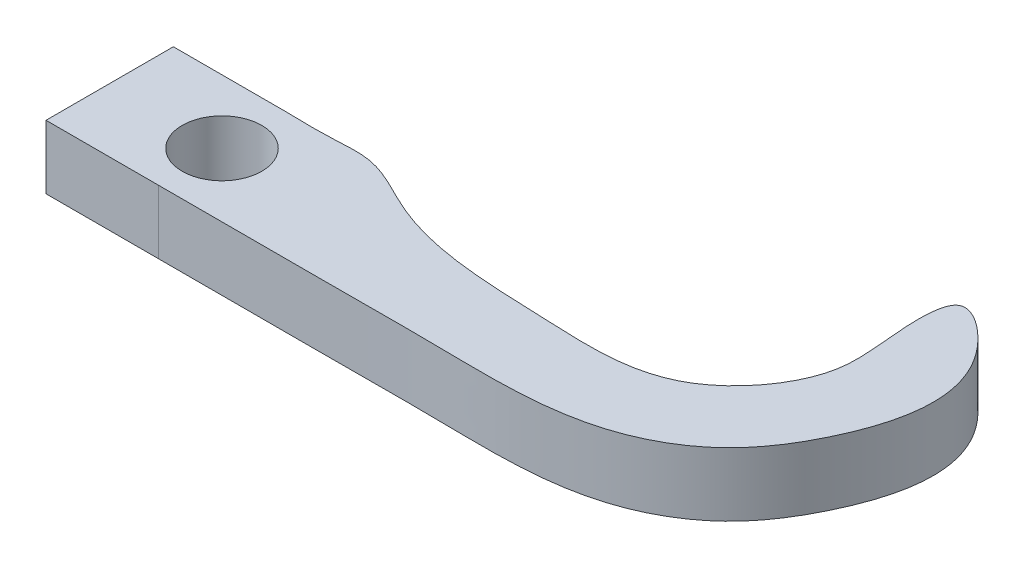
ISO-10303-21;
HEADER;
FILE_DESCRIPTION(('STEP AP214'),'2;1');
FILE_NAME('part.step','',(''),(''),'','','');
FILE_SCHEMA(('AUTOMOTIVE_DESIGN { 1 0 10303 214 1 1 1 1 }'));
ENDSEC;
DATA;
#1=APPLICATION_CONTEXT('core data for automotive mechanical design processes');
#2=APPLICATION_PROTOCOL_DEFINITION('international standard','automotive_design',2000,#1);
#3=PRODUCT_CONTEXT('',#1,'mechanical');
#4=PRODUCT('Part','Part','',(#3));
#5=PRODUCT_RELATED_PRODUCT_CATEGORY('part','',(#4));
#6=PRODUCT_DEFINITION_FORMATION('','',#4);
#7=PRODUCT_DEFINITION_CONTEXT('part definition',#1,'design');
#8=PRODUCT_DEFINITION('design','',#6,#7);
#9=PRODUCT_DEFINITION_SHAPE('','',#8);
#10=(LENGTH_UNIT() NAMED_UNIT(*) SI_UNIT(.MILLI.,.METRE.));
#11=(NAMED_UNIT(*) PLANE_ANGLE_UNIT() SI_UNIT($,.RADIAN.));
#12=(NAMED_UNIT(*) SI_UNIT($,.STERADIAN.) SOLID_ANGLE_UNIT());
#13=UNCERTAINTY_MEASURE_WITH_UNIT(LENGTH_MEASURE(1.E-05),#10,'distance_accuracy_value','');
#14=(GEOMETRIC_REPRESENTATION_CONTEXT(3) GLOBAL_UNCERTAINTY_ASSIGNED_CONTEXT((#13)) GLOBAL_UNIT_ASSIGNED_CONTEXT((#10,
#11,#12)) REPRESENTATION_CONTEXT('',''));
#15=CARTESIAN_POINT('',(0.,0.,0.));
#16=DIRECTION('',(0.,0.,1.));
#17=DIRECTION('',(1.,0.,0.));
#18=AXIS2_PLACEMENT_3D('',#15,#16,#17);
#19=CARTESIAN_POINT('',(35.1912141041976,4.,-12.0045204925512));
#20=DIRECTION('',(0.,-1.,0.));
#21=DIRECTION('',(0.,0.,-1.));
#22=AXIS2_PLACEMENT_3D('',#19,#20,#21);
#23=PLANE('',#22);
#24=DIRECTION('',(-1.,0.,0.));
#25=VECTOR('',#24,1.);
#26=CARTESIAN_POINT('',(0.,4.,-4.));
#27=LINE('',#26,#25);
#28=CARTESIAN_POINT('',(0.,4.,-4.));
#29=VERTEX_POINT('',#28);
#30=CARTESIAN_POINT('',(-7.05322672147617,4.,-4.));
#31=VERTEX_POINT('',#30);
#32=EDGE_CURVE('E105',#29,#31,#27,.T.);
#33=ORIENTED_EDGE('',*,*,#32,.T.);
#34=DIRECTION('',(0.,0.,1.));
#35=VECTOR('',#34,1.);
#36=CARTESIAN_POINT('',(-7.05322672147617,4.,-4.));
#37=LINE('',#36,#35);
#38=CARTESIAN_POINT('',(-7.05322672147617,4.,4.));
#39=VERTEX_POINT('',#38);
#40=EDGE_CURVE('E98',#31,#39,#37,.T.);
#41=ORIENTED_EDGE('',*,*,#40,.T.);
#42=DIRECTION('',(1.,0.,0.));
#43=VECTOR('',#42,1.);
#44=CARTESIAN_POINT('',(-7.05322672147617,4.,4.));
#45=LINE('',#44,#43);
#46=CARTESIAN_POINT('',(0.,4.,4.));
#47=VERTEX_POINT('',#46);
#48=EDGE_CURVE('E104',#39,#47,#45,.T.);
#49=ORIENTED_EDGE('',*,*,#48,.T.);
#50=CARTESIAN_POINT('',(0.,4.,-4.));
#51=CARTESIAN_POINT('',(0.965154345947019,4.,-3.97792964392842));
#52=CARTESIAN_POINT('',(2.67626900055874,4.,-3.93880128081721));
#53=CARTESIAN_POINT('',(5.74833844442336,4.,-4.23512677444015));
#54=CARTESIAN_POINT('',(10.7984314772553,4.,-1.04303073581933));
#55=CARTESIAN_POINT('',(18.4189312249459,4.,-0.983332766275496));
#56=CARTESIAN_POINT('',(27.4063160734475,4.,-0.415105224257914));
#57=CARTESIAN_POINT('',(31.8485847497434,4.,-6.50956385262234));
#58=CARTESIAN_POINT('',(31.178499136289,4.,-10.5990477140092));
#59=CARTESIAN_POINT('',(31.0094108606181,4.,-15.9202524369857));
#60=CARTESIAN_POINT('',(37.3084497130983,4.,-11.2163061526473));
#61=CARTESIAN_POINT('',(35.8049970075755,4.,-4.56724095293301));
#62=CARTESIAN_POINT('',(32.4111479345509,4.,0.650692495093639));
#63=CARTESIAN_POINT('',(26.4670565607253,4.,4.2639642325186));
#64=CARTESIAN_POINT('',(18.8603426250174,4.,3.94179808510999));
#65=CARTESIAN_POINT('',(11.6430989519811,4.,4.00660071043614));
#66=CARTESIAN_POINT('',(5.80742249566911,4.,3.99764544498582));
#67=CARTESIAN_POINT('',(2.23579185294919,4.,3.99909352300062));
#68=CARTESIAN_POINT('',(0.,4.,4.));
#69=B_SPLINE_CURVE_WITH_KNOTS('',3,(#50,#51,#52,#53,#54,#55,#56,#57,#58,#59,#60,#61,#62,#63,#64,
#65,#66,#67,#68),.UNSPECIFIED.,.F.,.F.,(4,1,1,1,1,1,1,1,1,1,1,1,1,1,1,1,4),(0.,
0.0315230282209945,0.0558869322540911,0.0980024449357112,0.216060448083261,0.302293822302607,
0.37341837284398,0.416617427236156,0.454314907816136,0.48895260099763,0.591586624010205,
0.647126474055905,0.690459149561825,0.810546038048183,0.883818874327126,0.927272206946891,1.),.UNSPECIFIED.);
#70=EDGE_CURVE('E114',#29,#47,#69,.T.);
#71=ORIENTED_EDGE('',*,*,#70,.F.);
#72=EDGE_LOOP('',(#33,#41,#49,#71));
#73=FACE_BOUND('',#72,.T.);
#74=CARTESIAN_POINT('',(0.,4.,0.));
#75=DIRECTION('',(0.,1.,0.));
#76=DIRECTION('',(0.,0.,1.));
#77=AXIS2_PLACEMENT_3D('',#74,#75,#76);
#78=CIRCLE('',#77,2.5);
#79=CARTESIAN_POINT('',(0.,4.,2.5));
#80=VERTEX_POINT('',#79);
#81=EDGE_CURVE('E153',#80,#80,#78,.T.);
#82=ORIENTED_EDGE('',*,*,#81,.F.);
#83=EDGE_LOOP('',(#82));
#84=FACE_BOUND('',#83,.T.);
#85=ADVANCED_FACE('F55',(#73,#84),#23,.F.);
#86=CARTESIAN_POINT('',(35.1912141041976,0.,-12.0045204925512));
#87=DIRECTION('',(0.,-1.,0.));
#88=DIRECTION('',(0.,0.,-1.));
#89=AXIS2_PLACEMENT_3D('',#86,#87,#88);
#90=PLANE('',#89);
#91=DIRECTION('',(-1.,0.,0.));
#92=VECTOR('',#91,1.);
#93=CARTESIAN_POINT('',(0.,0.,-4.));
#94=LINE('',#93,#92);
#95=CARTESIAN_POINT('',(0.,0.,-4.));
#96=VERTEX_POINT('',#95);
#97=CARTESIAN_POINT('',(-7.05322672147617,0.,-4.));
#98=VERTEX_POINT('',#97);
#99=EDGE_CURVE('E122',#96,#98,#94,.T.);
#100=ORIENTED_EDGE('',*,*,#99,.F.);
#101=CARTESIAN_POINT('',(0.,0.,-4.));
#102=CARTESIAN_POINT('',(0.965154345947019,0.,-3.97792964392842));
#103=CARTESIAN_POINT('',(2.67626900055874,0.,-3.93880128081721));
#104=CARTESIAN_POINT('',(5.74833844442336,0.,-4.23512677444015));
#105=CARTESIAN_POINT('',(10.7984314772553,0.,-1.04303073581933));
#106=CARTESIAN_POINT('',(18.4189312249459,0.,-0.983332766275496));
#107=CARTESIAN_POINT('',(27.4063160734475,0.,-0.415105224257914));
#108=CARTESIAN_POINT('',(31.8485847497434,0.,-6.50956385262234));
#109=CARTESIAN_POINT('',(31.178499136289,0.,-10.5990477140092));
#110=CARTESIAN_POINT('',(31.0094108606181,0.,-15.9202524369857));
#111=CARTESIAN_POINT('',(37.3084497130983,0.,-11.2163061526473));
#112=CARTESIAN_POINT('',(35.8049970075755,0.,-4.56724095293301));
#113=CARTESIAN_POINT('',(32.4111479345509,0.,0.650692495093639));
#114=CARTESIAN_POINT('',(26.4670565607253,0.,4.2639642325186));
#115=CARTESIAN_POINT('',(18.8603426250174,0.,3.94179808510999));
#116=CARTESIAN_POINT('',(11.6430989519811,0.,4.00660071043614));
#117=CARTESIAN_POINT('',(5.80742249566911,0.,3.99764544498582));
#118=CARTESIAN_POINT('',(2.23579185294919,0.,3.99909352300062));
#119=CARTESIAN_POINT('',(0.,0.,4.));
#120=B_SPLINE_CURVE_WITH_KNOTS('',3,(#101,#102,#103,#104,#105,#106,#107,#108,#109,#110,#111,
#112,#113,#114,#115,#116,#117,#118,#119),.UNSPECIFIED.,.F.,.F.,(4,1,1,1,1,1,1,1,1,1,1,1,1,1,1,1,
4),(0.,0.0315230282209945,0.0558869322540911,0.0980024449357112,0.216060448083261,
0.302293822302607,0.37341837284398,0.416617427236156,0.454314907816136,0.48895260099763,
0.591586624010205,0.647126474055905,0.690459149561825,0.810546038048183,0.883818874327126,
0.927272206946891,1.),.UNSPECIFIED.);
#121=CARTESIAN_POINT('',(0.,0.,4.));
#122=VERTEX_POINT('',#121);
#123=EDGE_CURVE('E160',#96,#122,#120,.T.);
#124=ORIENTED_EDGE('',*,*,#123,.T.);
#125=DIRECTION('',(1.,0.,0.));
#126=VECTOR('',#125,1.);
#127=CARTESIAN_POINT('',(-7.05322672147617,0.,4.));
#128=LINE('',#127,#126);
#129=CARTESIAN_POINT('',(-7.05322672147617,0.,4.));
#130=VERTEX_POINT('',#129);
#131=EDGE_CURVE('E162',#130,#122,#128,.T.);
#132=ORIENTED_EDGE('',*,*,#131,.F.);
#133=DIRECTION('',(0.,0.,1.));
#134=VECTOR('',#133,1.);
#135=CARTESIAN_POINT('',(-7.05322672147617,0.,-4.));
#136=LINE('',#135,#134);
#137=EDGE_CURVE('E110',#98,#130,#136,.T.);
#138=ORIENTED_EDGE('',*,*,#137,.F.);
#139=EDGE_LOOP('',(#100,#124,#132,#138));
#140=FACE_BOUND('',#139,.T.);
#141=CARTESIAN_POINT('',(0.,0.,0.));
#142=DIRECTION('',(0.,1.,0.));
#143=DIRECTION('',(0.,0.,1.));
#144=AXIS2_PLACEMENT_3D('',#141,#142,#143);
#145=CIRCLE('',#144,2.5);
#146=CARTESIAN_POINT('',(0.,0.,2.5));
#147=VERTEX_POINT('',#146);
#148=EDGE_CURVE('E156',#147,#147,#145,.T.);
#149=ORIENTED_EDGE('',*,*,#148,.T.);
#150=EDGE_LOOP('',(#149));
#151=FACE_BOUND('',#150,.T.);
#152=ADVANCED_FACE('F133',(#140,#151),#90,.T.);
#153=CARTESIAN_POINT('',(0.,4.,-4.));
#154=DIRECTION('',(0.,0.,1.));
#155=DIRECTION('',(1.,0.,0.));
#156=AXIS2_PLACEMENT_3D('',#153,#154,#155);
#157=PLANE('',#156);
#158=ORIENTED_EDGE('',*,*,#99,.T.);
#159=DIRECTION('',(0.,-1.,0.));
#160=VECTOR('',#159,1.);
#161=CARTESIAN_POINT('',(-7.05322672147617,4.,-4.));
#162=LINE('',#161,#160);
#163=EDGE_CURVE('E12',#31,#98,#162,.T.);
#164=ORIENTED_EDGE('',*,*,#163,.F.);
#165=ORIENTED_EDGE('',*,*,#32,.F.);
#166=DIRECTION('',(0.,-1.,0.));
#167=VECTOR('',#166,1.);
#168=CARTESIAN_POINT('',(0.,4.,-4.));
#169=LINE('',#168,#167);
#170=EDGE_CURVE('E72',#29,#96,#169,.T.);
#171=ORIENTED_EDGE('',*,*,#170,.T.);
#172=EDGE_LOOP('',(#158,#164,#165,#171));
#173=FACE_BOUND('',#172,.T.);
#174=ADVANCED_FACE('F57',(#173),#157,.F.);
#175=CARTESIAN_POINT('',(-7.05322672147617,4.,-4.));
#176=DIRECTION('',(1.,0.,0.));
#177=DIRECTION('',(0.,0.,-1.));
#178=AXIS2_PLACEMENT_3D('',#175,#176,#177);
#179=PLANE('',#178);
#180=ORIENTED_EDGE('',*,*,#137,.T.);
#181=DIRECTION('',(0.,-1.,0.));
#182=VECTOR('',#181,1.);
#183=CARTESIAN_POINT('',(-7.05322672147617,4.,4.));
#184=LINE('',#183,#182);
#185=EDGE_CURVE('E64',#39,#130,#184,.T.);
#186=ORIENTED_EDGE('',*,*,#185,.F.);
#187=ORIENTED_EDGE('',*,*,#40,.F.);
#188=ORIENTED_EDGE('',*,*,#163,.T.);
#189=EDGE_LOOP('',(#180,#186,#187,#188));
#190=FACE_BOUND('',#189,.T.);
#191=ADVANCED_FACE('F109',(#190),#179,.F.);
#192=CARTESIAN_POINT('',(-7.05322672147617,4.,4.));
#193=DIRECTION('',(0.,0.,-1.));
#194=DIRECTION('',(-1.,0.,0.));
#195=AXIS2_PLACEMENT_3D('',#192,#193,#194);
#196=PLANE('',#195);
#197=ORIENTED_EDGE('',*,*,#131,.T.);
#198=DIRECTION('',(0.,-1.,0.));
#199=VECTOR('',#198,1.);
#200=CARTESIAN_POINT('',(0.,4.,4.));
#201=LINE('',#200,#199);
#202=EDGE_CURVE('E87',#47,#122,#201,.T.);
#203=ORIENTED_EDGE('',*,*,#202,.F.);
#204=ORIENTED_EDGE('',*,*,#48,.F.);
#205=ORIENTED_EDGE('',*,*,#185,.T.);
#206=EDGE_LOOP('',(#197,#203,#204,#205));
#207=FACE_BOUND('',#206,.T.);
#208=ADVANCED_FACE('F113',(#207),#196,.F.);
#209=DIRECTION('',(0.,-1.,0.));
#210=VECTOR('',#209,1.);
#211=SURFACE_OF_LINEAR_EXTRUSION('',#69,#210);
#212=ORIENTED_EDGE('',*,*,#123,.F.);
#213=ORIENTED_EDGE('',*,*,#170,.F.);
#214=ORIENTED_EDGE('',*,*,#70,.T.);
#215=ORIENTED_EDGE('',*,*,#202,.T.);
#216=EDGE_LOOP('',(#212,#213,#214,#215));
#217=FACE_BOUND('',#216,.T.);
#218=ADVANCED_FACE('F128',(#217),#211,.T.);
#219=CARTESIAN_POINT('',(0.,4.,0.));
#220=DIRECTION('',(0.,-1.,0.));
#221=DIRECTION('',(0.,0.,-1.));
#222=AXIS2_PLACEMENT_3D('',#219,#220,#221);
#223=CYLINDRICAL_SURFACE('',#222,2.5);
#224=ORIENTED_EDGE('',*,*,#81,.T.);
#225=EDGE_LOOP('',(#224));
#226=FACE_BOUND('',#225,.T.);
#227=ORIENTED_EDGE('',*,*,#148,.F.);
#228=EDGE_LOOP('',(#227));
#229=FACE_BOUND('',#228,.T.);
#230=ADVANCED_FACE('F132',(#226,#229),#223,.F.);
#231=CLOSED_SHELL('',(#85,#152,#174,#191,#208,#218,#230));
#232=MANIFOLD_SOLID_BREP('B2',#231);
#233=ADVANCED_BREP_SHAPE_REPRESENTATION('',(#18,#232),#14);
#234=SHAPE_DEFINITION_REPRESENTATION(#9,#233);
ENDSEC;
END-ISO-10303-21;
